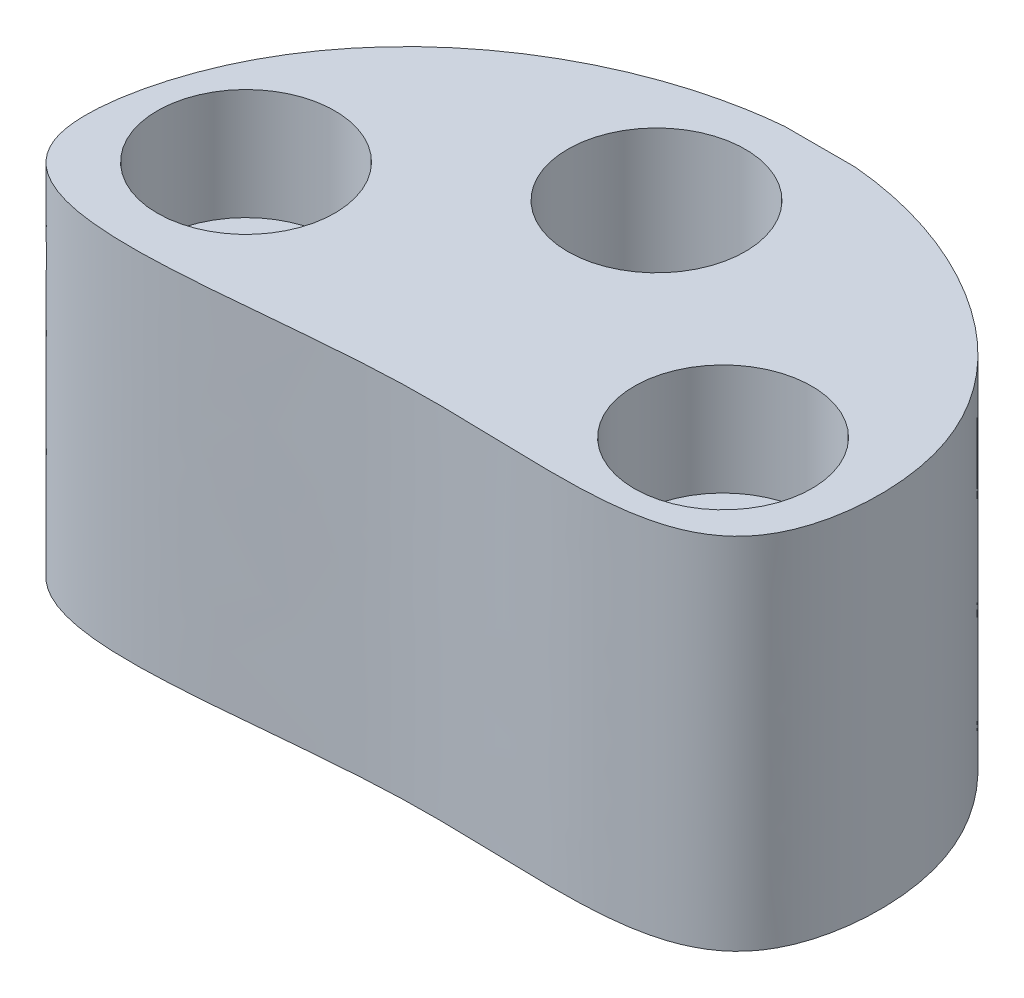
ISO-10303-21;
HEADER;
FILE_DESCRIPTION(('STEP AP214'),'2;1');
FILE_NAME('part.step','',(''),(''),'','','');
FILE_SCHEMA(('AUTOMOTIVE_DESIGN { 1 0 10303 214 1 1 1 1 }'));
ENDSEC;
DATA;
#1=APPLICATION_CONTEXT('core data for automotive mechanical design processes');
#2=APPLICATION_PROTOCOL_DEFINITION('international standard','automotive_design',2000,#1);
#3=PRODUCT_CONTEXT('',#1,'mechanical');
#4=PRODUCT('Part','Part','',(#3));
#5=PRODUCT_RELATED_PRODUCT_CATEGORY('part','',(#4));
#6=PRODUCT_DEFINITION_FORMATION('','',#4);
#7=PRODUCT_DEFINITION_CONTEXT('part definition',#1,'design');
#8=PRODUCT_DEFINITION('design','',#6,#7);
#9=PRODUCT_DEFINITION_SHAPE('','',#8);
#10=(LENGTH_UNIT() NAMED_UNIT(*) SI_UNIT(.MILLI.,.METRE.));
#11=(NAMED_UNIT(*) PLANE_ANGLE_UNIT() SI_UNIT($,.RADIAN.));
#12=(NAMED_UNIT(*) SI_UNIT($,.STERADIAN.) SOLID_ANGLE_UNIT());
#13=UNCERTAINTY_MEASURE_WITH_UNIT(LENGTH_MEASURE(1.E-05),#10,'distance_accuracy_value','');
#14=(GEOMETRIC_REPRESENTATION_CONTEXT(3) GLOBAL_UNCERTAINTY_ASSIGNED_CONTEXT((#13)) GLOBAL_UNIT_ASSIGNED_CONTEXT((#10,
#11,#12)) REPRESENTATION_CONTEXT('',''));
#15=CARTESIAN_POINT('',(0.,0.,0.));
#16=DIRECTION('',(0.,0.,1.));
#17=DIRECTION('',(1.,0.,0.));
#18=AXIS2_PLACEMENT_3D('',#15,#16,#17);
#19=CARTESIAN_POINT('',(0.,16.2,0.));
#20=DIRECTION('',(0.,1.,0.));
#21=DIRECTION('',(0.,0.,1.));
#22=AXIS2_PLACEMENT_3D('',#19,#20,#21);
#23=PLANE('',#22);
#24=CARTESIAN_POINT('',(0.,16.2,-5.77753755591892));
#25=CARTESIAN_POINT('',(3.52767390357258,16.2,-6.09650056633771));
#26=CARTESIAN_POINT('',(10.3102398999708,16.2,-4.66905441931679));
#27=CARTESIAN_POINT('',(17.0648847004716,16.2,2.21575235919229));
#28=CARTESIAN_POINT('',(16.1424300908654,16.2,14.5522563606432));
#29=CARTESIAN_POINT('',(0.75103690976769,16.2,11.1767037141176));
#30=CARTESIAN_POINT('',(-17.3251775669006,16.2,16.1220302652709));
#31=CARTESIAN_POINT('',(-15.0454765799579,16.2,0.288280079287506));
#32=CARTESIAN_POINT('',(-6.68524136852007,16.2,-5.17307558733393));
#33=CARTESIAN_POINT('',(0.,16.2,-5.77753755591892));
#34=B_SPLINE_CURVE_WITH_KNOTS('',3,(#24,#25,#26,#27,#28,#29,#30,#31,#32,#33),.UNSPECIFIED.,.T.,
.F.,(4,1,1,1,1,1,1,4),(0.,0.12451864120477,0.2404883512057,0.321005699593671,0.49306052810502,
0.707392641280147,0.764026609576638,1.),.UNSPECIFIED.);
#35=CARTESIAN_POINT('',(3.19133898553194,16.2,-5.77753755591892));
#36=VERTEX_POINT('',#35);
#37=CARTESIAN_POINT('',(0.,16.2,-5.77753755591892));
#38=VERTEX_POINT('',#37);
#39=EDGE_CURVE('E74',#36,#38,#34,.T.);
#40=ORIENTED_EDGE('',*,*,#39,.F.);
#41=DIRECTION('',(1.,0.,0.));
#42=VECTOR('',#41,1.);
#43=CARTESIAN_POINT('',(-15.9820462418152,16.2,-5.77753755591892));
#44=LINE('',#43,#42);
#45=EDGE_CURVE('E91',#38,#36,#44,.T.);
#46=ORIENTED_EDGE('',*,*,#45,.F.);
#47=EDGE_LOOP('',(#40,#46));
#48=FACE_BOUND('',#47,.T.);
#49=CARTESIAN_POINT('',(0.,16.2,0.));
#50=DIRECTION('',(0.,1.,0.));
#51=DIRECTION('',(0.,0.,1.));
#52=AXIS2_PLACEMENT_3D('',#49,#50,#51);
#53=CIRCLE('',#52,4.);
#54=CARTESIAN_POINT('',(0.,16.2,4.));
#55=VERTEX_POINT('',#54);
#56=EDGE_CURVE('E96',#55,#55,#53,.T.);
#57=ORIENTED_EDGE('',*,*,#56,.F.);
#58=EDGE_LOOP('',(#57));
#59=FACE_BOUND('',#58,.T.);
#60=CARTESIAN_POINT('',(10.75,16.2,7.75));
#61=DIRECTION('',(0.,-1.,0.));
#62=DIRECTION('',(0.,0.,1.));
#63=AXIS2_PLACEMENT_3D('',#60,#61,#62);
#64=CIRCLE('',#63,4.);
#65=CARTESIAN_POINT('',(10.75,16.2,11.75));
#66=VERTEX_POINT('',#65);
#67=EDGE_CURVE('E109',#66,#66,#64,.T.);
#68=ORIENTED_EDGE('',*,*,#67,.T.);
#69=EDGE_LOOP('',(#68));
#70=FACE_BOUND('',#69,.T.);
#71=CARTESIAN_POINT('',(-10.75,16.2,7.75));
#72=DIRECTION('',(0.,1.,0.));
#73=DIRECTION('',(0.,0.,1.));
#74=AXIS2_PLACEMENT_3D('',#71,#72,#73);
#75=CIRCLE('',#74,4.);
#76=CARTESIAN_POINT('',(-10.75,16.2,11.75));
#77=VERTEX_POINT('',#76);
#78=EDGE_CURVE('E105',#77,#77,#75,.T.);
#79=ORIENTED_EDGE('',*,*,#78,.F.);
#80=EDGE_LOOP('',(#79));
#81=FACE_BOUND('',#80,.T.);
#82=ADVANCED_FACE('F60',(#48,#59,#70,#81),#23,.T.);
#83=CARTESIAN_POINT('',(0.,0.,0.));
#84=DIRECTION('',(0.,1.,0.));
#85=DIRECTION('',(0.,0.,1.));
#86=AXIS2_PLACEMENT_3D('',#83,#84,#85);
#87=PLANE('',#86);
#88=CARTESIAN_POINT('',(0.,0.,0.));
#89=DIRECTION('',(0.,1.,0.));
#90=DIRECTION('',(0.,0.,1.));
#91=AXIS2_PLACEMENT_3D('',#88,#89,#90);
#92=CIRCLE('',#91,4.);
#93=CARTESIAN_POINT('',(0.,0.,4.));
#94=VERTEX_POINT('',#93);
#95=EDGE_CURVE('E104',#94,#94,#92,.T.);
#96=ORIENTED_EDGE('',*,*,#95,.T.);
#97=EDGE_LOOP('',(#96));
#98=FACE_BOUND('',#97,.T.);
#99=DIRECTION('',(1.,0.,0.));
#100=VECTOR('',#99,1.);
#101=CARTESIAN_POINT('',(0.,0.,-5.77753755591892));
#102=LINE('',#101,#100);
#103=CARTESIAN_POINT('',(0.,0.,-5.77753755591892));
#104=VERTEX_POINT('',#103);
#105=CARTESIAN_POINT('',(3.19133898553194,0.,-5.77753755591892));
#106=VERTEX_POINT('',#105);
#107=EDGE_CURVE('E94',#104,#106,#102,.T.);
#108=ORIENTED_EDGE('',*,*,#107,.T.);
#109=CARTESIAN_POINT('',(0.,0.,-5.77753755591892));
#110=CARTESIAN_POINT('',(3.52767390357258,0.,-6.09650056633771));
#111=CARTESIAN_POINT('',(10.3102398999708,0.,-4.66905441931679));
#112=CARTESIAN_POINT('',(17.0648847004716,0.,2.21575235919229));
#113=CARTESIAN_POINT('',(16.1424300908654,0.,14.5522563606432));
#114=CARTESIAN_POINT('',(0.75103690976769,0.,11.1767037141176));
#115=CARTESIAN_POINT('',(-17.3251775669006,0.,16.1220302652709));
#116=CARTESIAN_POINT('',(-15.0454765799579,0.,0.288280079287506));
#117=CARTESIAN_POINT('',(-6.68524136852007,0.,-5.17307558733393));
#118=CARTESIAN_POINT('',(0.,0.,-5.77753755591892));
#119=B_SPLINE_CURVE_WITH_KNOTS('',3,(#109,#110,#111,#112,#113,#114,#115,#116,#117,#118),
.UNSPECIFIED.,.T.,.F.,(4,1,1,1,1,1,1,4),(0.,0.12451864120477,0.2404883512057,0.321005699593671,
0.49306052810502,0.707392641280147,0.764026609576638,1.),.UNSPECIFIED.);
#120=EDGE_CURVE('E83',#106,#104,#119,.T.);
#121=ORIENTED_EDGE('',*,*,#120,.T.);
#122=EDGE_LOOP('',(#108,#121));
#123=FACE_BOUND('',#122,.T.);
#124=ADVANCED_FACE('F120',(#98,#123),#87,.F.);
#125=CARTESIAN_POINT('',(-10.75,11.2,7.75));
#126=DIRECTION('',(0.,1.,0.));
#127=DIRECTION('',(0.,0.,1.));
#128=AXIS2_PLACEMENT_3D('',#125,#126,#127);
#129=CYLINDRICAL_SURFACE('',#128,4.);
#130=CARTESIAN_POINT('',(-10.75,11.2,7.75));
#131=DIRECTION('',(0.,1.,0.));
#132=DIRECTION('',(0.,0.,1.));
#133=AXIS2_PLACEMENT_3D('',#130,#131,#132);
#134=CIRCLE('',#133,4.);
#135=CARTESIAN_POINT('',(-10.75,11.2,11.75));
#136=VERTEX_POINT('',#135);
#137=EDGE_CURVE('E108',#136,#136,#134,.T.);
#138=ORIENTED_EDGE('',*,*,#137,.F.);
#139=EDGE_LOOP('',(#138));
#140=FACE_BOUND('',#139,.T.);
#141=ORIENTED_EDGE('',*,*,#78,.T.);
#142=EDGE_LOOP('',(#141));
#143=FACE_BOUND('',#142,.T.);
#144=ADVANCED_FACE('F141',(#140,#143),#129,.F.);
#145=CARTESIAN_POINT('',(-10.75,11.2,7.75));
#146=DIRECTION('',(0.,1.,0.));
#147=DIRECTION('',(0.,0.,1.));
#148=AXIS2_PLACEMENT_3D('',#145,#146,#147);
#149=PLANE('',#148);
#150=ORIENTED_EDGE('',*,*,#137,.T.);
#151=EDGE_LOOP('',(#150));
#152=FACE_BOUND('',#151,.T.);
#153=ADVANCED_FACE('F145',(#152),#149,.T.);
#154=CARTESIAN_POINT('',(10.75,11.2,7.75));
#155=DIRECTION('',(0.,1.,0.));
#156=DIRECTION('',(0.,0.,1.));
#157=AXIS2_PLACEMENT_3D('',#154,#155,#156);
#158=CYLINDRICAL_SURFACE('',#157,4.);
#159=CARTESIAN_POINT('',(10.75,11.2,7.75));
#160=DIRECTION('',(0.,-1.,0.));
#161=DIRECTION('',(0.,0.,1.));
#162=AXIS2_PLACEMENT_3D('',#159,#160,#161);
#163=CIRCLE('',#162,4.);
#164=CARTESIAN_POINT('',(10.75,11.2,11.75));
#165=VERTEX_POINT('',#164);
#166=EDGE_CURVE('E112',#165,#165,#163,.T.);
#167=ORIENTED_EDGE('',*,*,#166,.T.);
#168=EDGE_LOOP('',(#167));
#169=FACE_BOUND('',#168,.T.);
#170=ORIENTED_EDGE('',*,*,#67,.F.);
#171=EDGE_LOOP('',(#170));
#172=FACE_BOUND('',#171,.T.);
#173=ADVANCED_FACE('F133',(#169,#172),#158,.F.);
#174=CARTESIAN_POINT('',(10.75,11.2,7.75));
#175=DIRECTION('',(0.,1.,0.));
#176=DIRECTION('',(0.,0.,1.));
#177=AXIS2_PLACEMENT_3D('',#174,#175,#176);
#178=PLANE('',#177);
#179=ORIENTED_EDGE('',*,*,#166,.F.);
#180=EDGE_LOOP('',(#179));
#181=FACE_BOUND('',#180,.T.);
#182=ADVANCED_FACE('F125',(#181),#178,.T.);
#183=CARTESIAN_POINT('',(0.,-0.800000000000002,0.));
#184=DIRECTION('',(0.,1.,0.));
#185=DIRECTION('',(0.,0.,1.));
#186=AXIS2_PLACEMENT_3D('',#183,#184,#185);
#187=CYLINDRICAL_SURFACE('',#186,4.);
#188=ORIENTED_EDGE('',*,*,#56,.T.);
#189=EDGE_LOOP('',(#188));
#190=FACE_BOUND('',#189,.T.);
#191=ORIENTED_EDGE('',*,*,#95,.F.);
#192=EDGE_LOOP('',(#191));
#193=FACE_BOUND('',#192,.T.);
#194=ADVANCED_FACE('F123',(#190,#193),#187,.F.);
#195=CARTESIAN_POINT('',(-15.9820462418152,-0.800000000000002,-5.77753755591892));
#196=DIRECTION('',(0.,0.,1.));
#197=DIRECTION('',(1.,0.,0.));
#198=AXIS2_PLACEMENT_3D('',#195,#196,#197);
#199=PLANE('',#198);
#200=ORIENTED_EDGE('',*,*,#45,.T.);
#201=DIRECTION('',(0.,1.,0.));
#202=VECTOR('',#201,1.);
#203=CARTESIAN_POINT('',(3.19133898553193,-0.800000000000002,-5.77753755591892));
#204=LINE('',#203,#202);
#205=EDGE_CURVE('E12',#36,#106,#204,.F.);
#206=ORIENTED_EDGE('',*,*,#205,.T.);
#207=ORIENTED_EDGE('',*,*,#107,.F.);
#208=DIRECTION('',(0.,1.,0.));
#209=VECTOR('',#208,1.);
#210=CARTESIAN_POINT('',(0.,-0.800000000000002,-5.77753755591892));
#211=LINE('',#210,#209);
#212=EDGE_CURVE('E67',#104,#38,#211,.T.);
#213=ORIENTED_EDGE('',*,*,#212,.T.);
#214=EDGE_LOOP('',(#200,#206,#207,#213));
#215=FACE_BOUND('',#214,.T.);
#216=ADVANCED_FACE('F93',(#215),#199,.F.);
#217=CARTESIAN_POINT('',(0.,-0.800000000000002,-5.77753755591892));
#218=CARTESIAN_POINT('',(3.52767390357258,-0.800000000000002,-6.09650056633771));
#219=CARTESIAN_POINT('',(10.3102398999708,-0.800000000000002,-4.66905441931679));
#220=CARTESIAN_POINT('',(17.0648847004716,-0.800000000000002,2.21575235919229));
#221=CARTESIAN_POINT('',(16.1424300908654,-0.800000000000002,14.5522563606432));
#222=CARTESIAN_POINT('',(0.75103690976769,-0.800000000000002,11.1767037141176));
#223=CARTESIAN_POINT('',(-17.3251775669006,-0.800000000000002,16.1220302652709));
#224=CARTESIAN_POINT('',(-15.0454765799579,-0.800000000000002,0.288280079287506));
#225=CARTESIAN_POINT('',(-6.68524136852007,-0.800000000000002,-5.17307558733393));
#226=CARTESIAN_POINT('',(0.,-0.800000000000002,-5.77753755591892));
#227=B_SPLINE_CURVE_WITH_KNOTS('',3,(#217,#218,#219,#220,#221,#222,#223,#224,#225,#226),
.UNSPECIFIED.,.T.,.F.,(4,1,1,1,1,1,1,4),(0.,0.12451864120477,0.2404883512057,0.321005699593671,
0.49306052810502,0.707392641280147,0.764026609576638,1.),.UNSPECIFIED.);
#228=DIRECTION('',(0.,1.,0.));
#229=VECTOR('',#228,1.);
#230=SURFACE_OF_LINEAR_EXTRUSION('',#227,#229);
#231=ORIENTED_EDGE('',*,*,#205,.F.);
#232=ORIENTED_EDGE('',*,*,#39,.T.);
#233=ORIENTED_EDGE('',*,*,#212,.F.);
#234=ORIENTED_EDGE('',*,*,#120,.F.);
#235=EDGE_LOOP('',(#231,#232,#233,#234));
#236=FACE_BOUND('',#235,.T.);
#237=ADVANCED_FACE('F82',(#236),#230,.F.);
#238=CLOSED_SHELL('',(#82,#124,#144,#153,#173,#182,#194,#216,#237));
#239=MANIFOLD_SOLID_BREP('B2',#238);
#240=ADVANCED_BREP_SHAPE_REPRESENTATION('',(#18,#239),#14);
#241=SHAPE_DEFINITION_REPRESENTATION(#9,#240);
ENDSEC;
END-ISO-10303-21;
